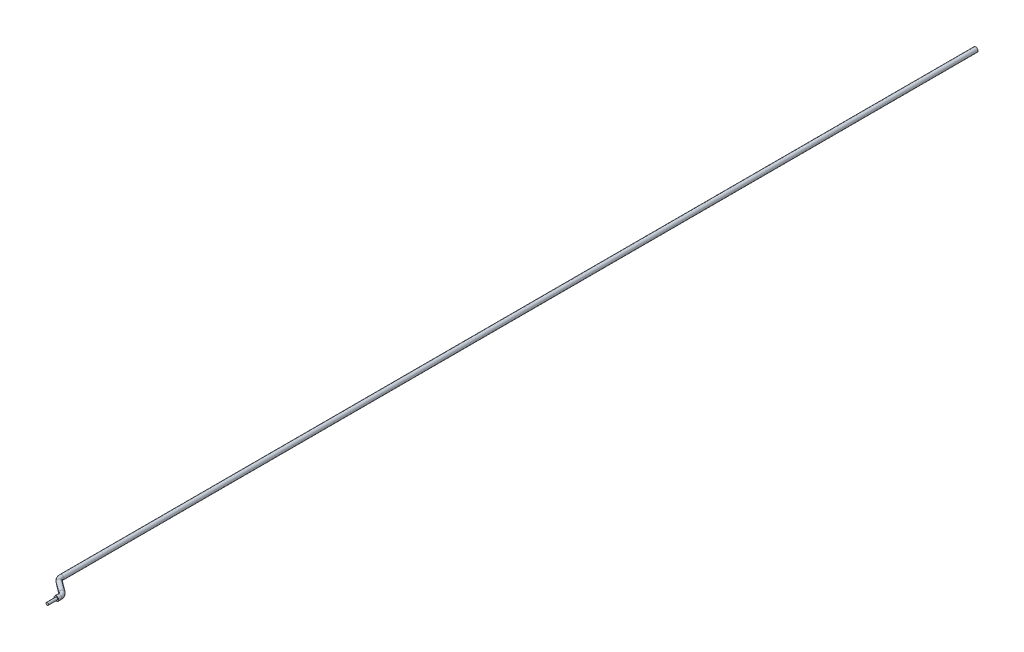
ISO-10303-21;
HEADER;
FILE_DESCRIPTION(('STEP AP214'),'2;1');
FILE_NAME('part.step','',(''),(''),'','','');
FILE_SCHEMA(('AUTOMOTIVE_DESIGN { 1 0 10303 214 1 1 1 1 }'));
ENDSEC;
DATA;
#1=APPLICATION_CONTEXT('core data for automotive mechanical design processes');
#2=APPLICATION_PROTOCOL_DEFINITION('international standard','automotive_design',2000,#1);
#3=PRODUCT_CONTEXT('',#1,'mechanical');
#4=PRODUCT('Part','Part','',(#3));
#5=PRODUCT_RELATED_PRODUCT_CATEGORY('part','',(#4));
#6=PRODUCT_DEFINITION_FORMATION('','',#4);
#7=PRODUCT_DEFINITION_CONTEXT('part definition',#1,'design');
#8=PRODUCT_DEFINITION('design','',#6,#7);
#9=PRODUCT_DEFINITION_SHAPE('','',#8);
#10=(LENGTH_UNIT() NAMED_UNIT(*) SI_UNIT(.MILLI.,.METRE.));
#11=(NAMED_UNIT(*) PLANE_ANGLE_UNIT() SI_UNIT($,.RADIAN.));
#12=(NAMED_UNIT(*) SI_UNIT($,.STERADIAN.) SOLID_ANGLE_UNIT());
#13=UNCERTAINTY_MEASURE_WITH_UNIT(LENGTH_MEASURE(1.E-05),#10,'distance_accuracy_value','');
#14=(GEOMETRIC_REPRESENTATION_CONTEXT(3) GLOBAL_UNCERTAINTY_ASSIGNED_CONTEXT((#13)) GLOBAL_UNIT_ASSIGNED_CONTEXT((#10,
#11,#12)) REPRESENTATION_CONTEXT('',''));
#15=CARTESIAN_POINT('',(0.,0.,0.));
#16=DIRECTION('',(0.,0.,1.));
#17=DIRECTION('',(1.,0.,0.));
#18=AXIS2_PLACEMENT_3D('',#15,#16,#17);
#19=CARTESIAN_POINT('',(0.,0.,3.));
#20=DIRECTION('',(0.,0.,1.));
#21=DIRECTION('',(1.,0.,0.));
#22=AXIS2_PLACEMENT_3D('',#19,#20,#21);
#23=PLANE('',#22);
#24=CARTESIAN_POINT('',(0.,0.,3.));
#25=DIRECTION('',(0.,0.,-1.));
#26=DIRECTION('',(-1.,0.,0.));
#27=AXIS2_PLACEMENT_3D('',#24,#25,#26);
#28=CIRCLE('',#27,0.4);
#29=CARTESIAN_POINT('',(-0.4,0.,3.));
#30=VERTEX_POINT('',#29);
#31=EDGE_CURVE('E18',#30,#30,#28,.T.);
#32=ORIENTED_EDGE('',*,*,#31,.F.);
#33=EDGE_LOOP('',(#32));
#34=FACE_BOUND('',#33,.T.);
#35=ADVANCED_FACE('F15',(#34),#23,.T.);
#36=CARTESIAN_POINT('',(0.,0.,3.));
#37=DIRECTION('',(0.,0.,-1.));
#38=DIRECTION('',(-1.,0.,0.));
#39=AXIS2_PLACEMENT_3D('',#36,#37,#38);
#40=CYLINDRICAL_SURFACE('',#39,0.4);
#41=CARTESIAN_POINT('',(0.,0.,0.));
#42=DIRECTION('',(0.,0.,-1.));
#43=DIRECTION('',(-1.,0.,0.));
#44=AXIS2_PLACEMENT_3D('',#41,#42,#43);
#45=CIRCLE('',#44,0.4);
#46=CARTESIAN_POINT('',(-0.4,0.,0.));
#47=VERTEX_POINT('',#46);
#48=EDGE_CURVE('E35',#47,#47,#45,.T.);
#49=ORIENTED_EDGE('',*,*,#48,.F.);
#50=EDGE_LOOP('',(#49));
#51=FACE_BOUND('',#50,.T.);
#52=ORIENTED_EDGE('',*,*,#31,.T.);
#53=EDGE_LOOP('',(#52));
#54=FACE_BOUND('',#53,.T.);
#55=ADVANCED_FACE('F42',(#51,#54),#40,.T.);
#56=CARTESIAN_POINT('',(0.,0.,0.));
#57=DIRECTION('',(0.,0.,1.));
#58=DIRECTION('',(1.,0.,0.));
#59=AXIS2_PLACEMENT_3D('',#56,#57,#58);
#60=PLANE('',#59);
#61=ORIENTED_EDGE('',*,*,#48,.T.);
#62=EDGE_LOOP('',(#61));
#63=FACE_BOUND('',#62,.T.);
#64=CARTESIAN_POINT('',(0.,0.,0.));
#65=DIRECTION('',(0.,0.,1.));
#66=DIRECTION('',(1.,0.,0.));
#67=AXIS2_PLACEMENT_3D('',#64,#65,#66);
#68=CIRCLE('',#67,0.75);
#69=CARTESIAN_POINT('',(0.75,0.,0.));
#70=VERTEX_POINT('',#69);
#71=EDGE_CURVE('E33',#70,#70,#68,.F.);
#72=ORIENTED_EDGE('',*,*,#71,.F.);
#73=EDGE_LOOP('',(#72));
#74=FACE_BOUND('',#73,.T.);
#75=ADVANCED_FACE('F49',(#63,#74),#60,.T.);
#76=CARTESIAN_POINT('',(0.,0.,-0.999999999999999));
#77=DIRECTION('',(0.,0.,1.));
#78=DIRECTION('',(1.,0.,0.));
#79=AXIS2_PLACEMENT_3D('',#76,#77,#78);
#80=CYLINDRICAL_SURFACE('',#79,0.75);
#81=ORIENTED_EDGE('',*,*,#71,.T.);
#82=EDGE_LOOP('',(#81));
#83=FACE_BOUND('',#82,.T.);
#84=CARTESIAN_POINT('',(0.,0.,-0.999999999999998));
#85=DIRECTION('',(0.,0.,-1.));
#86=DIRECTION('',(1.,0.,0.));
#87=AXIS2_PLACEMENT_3D('',#84,#85,#86);
#88=CIRCLE('',#87,0.75);
#89=CARTESIAN_POINT('',(0.750000000000001,0.,-0.999999999999997));
#90=VERTEX_POINT('',#89);
#91=EDGE_CURVE('E31',#90,#90,#88,.T.);
#92=ORIENTED_EDGE('',*,*,#91,.F.);
#93=EDGE_LOOP('',(#92));
#94=FACE_BOUND('',#93,.T.);
#95=ADVANCED_FACE('F79',(#83,#94),#80,.T.);
#96=CARTESIAN_POINT('',(-2.,0.,-1.));
#97=DIRECTION('',(0.,1.,0.));
#98=DIRECTION('',(0.,0.,1.));
#99=AXIS2_PLACEMENT_3D('',#96,#97,#98);
#100=TOROIDAL_SURFACE('',#99,2.,0.75);
#101=CARTESIAN_POINT('',(-0.800000000000001,0.,-2.6));
#102=DIRECTION('',(-0.8,0.,-0.6));
#103=DIRECTION('',(-0.6,0.,0.8));
#104=AXIS2_PLACEMENT_3D('',#101,#102,#103);
#105=CIRCLE('',#104,0.75);
#106=CARTESIAN_POINT('',(-1.25,0.,-2.));
#107=VERTEX_POINT('',#106);
#108=EDGE_CURVE('E73',#107,#107,#105,.T.);
#109=ORIENTED_EDGE('',*,*,#108,.F.);
#110=EDGE_LOOP('',(#109));
#111=FACE_BOUND('',#110,.T.);
#112=ORIENTED_EDGE('',*,*,#91,.T.);
#113=EDGE_LOOP('',(#112));
#114=FACE_BOUND('',#113,.T.);
#115=ADVANCED_FACE('F76',(#111,#114),#100,.T.);
#116=CARTESIAN_POINT('',(-0.800000000000001,0.,-2.6));
#117=DIRECTION('',(-0.8,0.,-0.6));
#118=DIRECTION('',(-0.6,0.,0.8));
#119=AXIS2_PLACEMENT_3D('',#116,#117,#118);
#120=CYLINDRICAL_SURFACE('',#119,0.75);
#121=CARTESIAN_POINT('',(-4.4,0.,-5.3));
#122=DIRECTION('',(-0.8,0.,-0.599999999999999));
#123=DIRECTION('',(-0.599999999999999,0.,0.8));
#124=AXIS2_PLACEMENT_3D('',#121,#122,#123);
#125=CIRCLE('',#124,0.75);
#126=CARTESIAN_POINT('',(-4.85,0.,-4.69999999999999));
#127=VERTEX_POINT('',#126);
#128=EDGE_CURVE('E27',#127,#127,#125,.T.);
#129=ORIENTED_EDGE('',*,*,#128,.F.);
#130=EDGE_LOOP('',(#129));
#131=FACE_BOUND('',#130,.T.);
#132=ORIENTED_EDGE('',*,*,#108,.T.);
#133=EDGE_LOOP('',(#132));
#134=FACE_BOUND('',#133,.T.);
#135=ADVANCED_FACE('F66',(#131,#134),#120,.T.);
#136=CARTESIAN_POINT('',(-3.2,0.,-6.9));
#137=DIRECTION('',(0.,-1.,0.));
#138=DIRECTION('',(0.,0.,-1.));
#139=AXIS2_PLACEMENT_3D('',#136,#137,#138);
#140=TOROIDAL_SURFACE('',#139,2.,0.75);
#141=ORIENTED_EDGE('',*,*,#128,.T.);
#142=EDGE_LOOP('',(#141));
#143=FACE_BOUND('',#142,.T.);
#144=CARTESIAN_POINT('',(-5.2,0.,-6.9));
#145=DIRECTION('',(0.,0.,-1.));
#146=DIRECTION('',(-1.,0.,0.));
#147=AXIS2_PLACEMENT_3D('',#144,#145,#146);
#148=CIRCLE('',#147,0.75);
#149=CARTESIAN_POINT('',(-5.95,0.,-6.9));
#150=VERTEX_POINT('',#149);
#151=EDGE_CURVE('E22',#150,#150,#148,.T.);
#152=ORIENTED_EDGE('',*,*,#151,.F.);
#153=EDGE_LOOP('',(#152));
#154=FACE_BOUND('',#153,.T.);
#155=ADVANCED_FACE('F58',(#143,#154),#140,.T.);
#156=CARTESIAN_POINT('',(-5.2,0.,-305.784803));
#157=DIRECTION('',(0.,0.,1.));
#158=DIRECTION('',(1.,0.,0.));
#159=AXIS2_PLACEMENT_3D('',#156,#157,#158);
#160=PLANE('',#159);
#161=CARTESIAN_POINT('',(-5.2,0.,-305.784803));
#162=DIRECTION('',(0.,0.,-1.));
#163=DIRECTION('',(-1.,0.,0.));
#164=AXIS2_PLACEMENT_3D('',#161,#162,#163);
#165=CIRCLE('',#164,0.75);
#166=CARTESIAN_POINT('',(-5.95,0.,-305.784803));
#167=VERTEX_POINT('',#166);
#168=EDGE_CURVE('E10',#167,#167,#165,.F.);
#169=ORIENTED_EDGE('',*,*,#168,.F.);
#170=EDGE_LOOP('',(#169));
#171=FACE_BOUND('',#170,.T.);
#172=ADVANCED_FACE('F53',(#171),#160,.F.);
#173=CARTESIAN_POINT('',(-5.2,0.,-6.9));
#174=DIRECTION('',(0.,0.,-1.));
#175=DIRECTION('',(-1.,0.,0.));
#176=AXIS2_PLACEMENT_3D('',#173,#174,#175);
#177=CYLINDRICAL_SURFACE('',#176,0.75);
#178=ORIENTED_EDGE('',*,*,#168,.T.);
#179=EDGE_LOOP('',(#178));
#180=FACE_BOUND('',#179,.T.);
#181=ORIENTED_EDGE('',*,*,#151,.T.);
#182=EDGE_LOOP('',(#181));
#183=FACE_BOUND('',#182,.T.);
#184=ADVANCED_FACE('F51',(#180,#183),#177,.T.);
#185=CLOSED_SHELL('',(#35,#55,#75,#95,#115,#135,#155,#172,#184));
#186=MANIFOLD_SOLID_BREP('B1',#185);
#187=ADVANCED_BREP_SHAPE_REPRESENTATION('',(#18,#186),#14);
#188=SHAPE_DEFINITION_REPRESENTATION(#9,#187);
ENDSEC;
END-ISO-10303-21;
